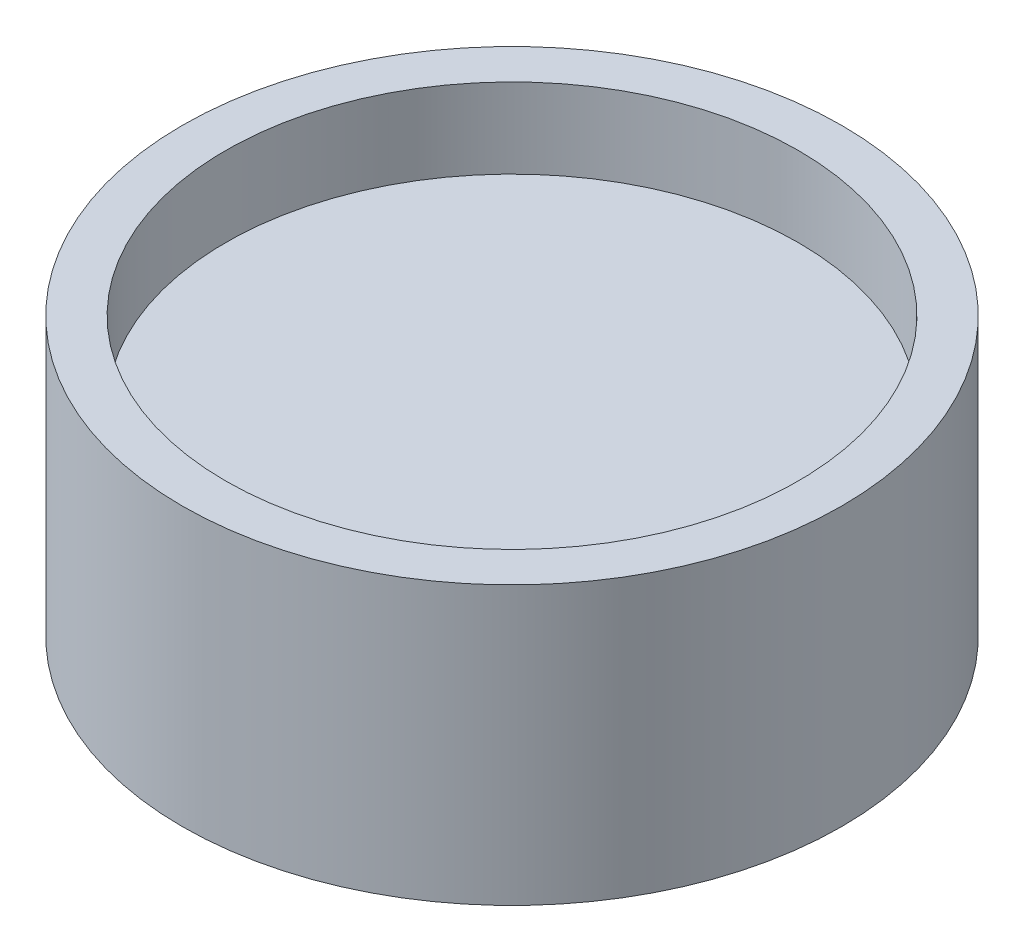
ISO-10303-21;
HEADER;
FILE_DESCRIPTION(('STEP AP214'),'2;1');
FILE_NAME('part.step','',(''),(''),'','','');
FILE_SCHEMA(('AUTOMOTIVE_DESIGN { 1 0 10303 214 1 1 1 1 }'));
ENDSEC;
DATA;
#1=APPLICATION_CONTEXT('core data for automotive mechanical design processes');
#2=APPLICATION_PROTOCOL_DEFINITION('international standard','automotive_design',2000,#1);
#3=PRODUCT_CONTEXT('',#1,'mechanical');
#4=PRODUCT('Part','Part','',(#3));
#5=PRODUCT_RELATED_PRODUCT_CATEGORY('part','',(#4));
#6=PRODUCT_DEFINITION_FORMATION('','',#4);
#7=PRODUCT_DEFINITION_CONTEXT('part definition',#1,'design');
#8=PRODUCT_DEFINITION('design','',#6,#7);
#9=PRODUCT_DEFINITION_SHAPE('','',#8);
#10=(LENGTH_UNIT() NAMED_UNIT(*) SI_UNIT(.MILLI.,.METRE.));
#11=(NAMED_UNIT(*) PLANE_ANGLE_UNIT() SI_UNIT($,.RADIAN.));
#12=(NAMED_UNIT(*) SI_UNIT($,.STERADIAN.) SOLID_ANGLE_UNIT());
#13=UNCERTAINTY_MEASURE_WITH_UNIT(LENGTH_MEASURE(1.E-05),#10,'distance_accuracy_value','');
#14=(GEOMETRIC_REPRESENTATION_CONTEXT(3) GLOBAL_UNCERTAINTY_ASSIGNED_CONTEXT((#13)) GLOBAL_UNIT_ASSIGNED_CONTEXT((#10,
#11,#12)) REPRESENTATION_CONTEXT('',''));
#15=CARTESIAN_POINT('',(0.,0.,0.));
#16=DIRECTION('',(0.,0.,1.));
#17=DIRECTION('',(1.,0.,0.));
#18=AXIS2_PLACEMENT_3D('',#15,#16,#17);
#19=CARTESIAN_POINT('',(0.,16.,0.));
#20=DIRECTION('',(0.,-1.,0.));
#21=DIRECTION('',(0.,0.,-1.));
#22=AXIS2_PLACEMENT_3D('',#19,#20,#21);
#23=CYLINDRICAL_SURFACE('',#22,19.);
#24=CARTESIAN_POINT('',(0.,16.,0.));
#25=DIRECTION('',(0.,1.,0.));
#26=DIRECTION('',(0.,0.,1.));
#27=AXIS2_PLACEMENT_3D('',#24,#25,#26);
#28=CIRCLE('',#27,19.);
#29=CARTESIAN_POINT('',(0.,16.,19.));
#30=VERTEX_POINT('',#29);
#31=EDGE_CURVE('E10',#30,#30,#28,.T.);
#32=ORIENTED_EDGE('',*,*,#31,.F.);
#33=EDGE_LOOP('',(#32));
#34=FACE_BOUND('',#33,.T.);
#35=CARTESIAN_POINT('',(0.,0.,0.));
#36=DIRECTION('',(0.,1.,0.));
#37=DIRECTION('',(0.,0.,1.));
#38=AXIS2_PLACEMENT_3D('',#35,#36,#37);
#39=CIRCLE('',#38,19.);
#40=CARTESIAN_POINT('',(0.,0.,19.));
#41=VERTEX_POINT('',#40);
#42=EDGE_CURVE('E40',#41,#41,#39,.T.);
#43=ORIENTED_EDGE('',*,*,#42,.T.);
#44=EDGE_LOOP('',(#43));
#45=FACE_BOUND('',#44,.T.);
#46=ADVANCED_FACE('F37',(#34,#45),#23,.T.);
#47=CARTESIAN_POINT('',(0.,16.,0.));
#48=DIRECTION('',(0.,1.,0.));
#49=DIRECTION('',(0.,0.,1.));
#50=AXIS2_PLACEMENT_3D('',#47,#48,#49);
#51=PLANE('',#50);
#52=CARTESIAN_POINT('',(0.,16.,0.));
#53=DIRECTION('',(0.,1.,0.));
#54=DIRECTION('',(0.,0.,1.));
#55=AXIS2_PLACEMENT_3D('',#52,#53,#54);
#56=CIRCLE('',#55,16.5);
#57=CARTESIAN_POINT('',(0.,16.,16.5));
#58=VERTEX_POINT('',#57);
#59=EDGE_CURVE('E49',#58,#58,#56,.T.);
#60=ORIENTED_EDGE('',*,*,#59,.F.);
#61=EDGE_LOOP('',(#60));
#62=FACE_BOUND('',#61,.T.);
#63=ORIENTED_EDGE('',*,*,#31,.T.);
#64=EDGE_LOOP('',(#63));
#65=FACE_BOUND('',#64,.T.);
#66=ADVANCED_FACE('F74',(#62,#65),#51,.T.);
#67=CARTESIAN_POINT('',(0.,0.,0.));
#68=DIRECTION('',(0.,1.,0.));
#69=DIRECTION('',(0.,0.,1.));
#70=AXIS2_PLACEMENT_3D('',#67,#68,#69);
#71=PLANE('',#70);
#72=CARTESIAN_POINT('',(0.,0.,0.));
#73=DIRECTION('',(0.,-1.,0.));
#74=DIRECTION('',(0.,0.,-1.));
#75=AXIS2_PLACEMENT_3D('',#72,#73,#74);
#76=CIRCLE('',#75,16.4);
#77=CARTESIAN_POINT('',(0.,0.,-16.4));
#78=VERTEX_POINT('',#77);
#79=EDGE_CURVE('E55',#78,#78,#76,.T.);
#80=ORIENTED_EDGE('',*,*,#79,.F.);
#81=EDGE_LOOP('',(#80));
#82=FACE_BOUND('',#81,.T.);
#83=ORIENTED_EDGE('',*,*,#42,.F.);
#84=EDGE_LOOP('',(#83));
#85=FACE_BOUND('',#84,.T.);
#86=ADVANCED_FACE('F70',(#82,#85),#71,.F.);
#87=CARTESIAN_POINT('',(0.,11.4,0.));
#88=DIRECTION('',(0.,1.,0.));
#89=DIRECTION('',(0.,0.,1.));
#90=AXIS2_PLACEMENT_3D('',#87,#88,#89);
#91=CYLINDRICAL_SURFACE('',#90,16.5);
#92=CARTESIAN_POINT('',(0.,11.4,0.));
#93=DIRECTION('',(0.,1.,0.));
#94=DIRECTION('',(0.,0.,1.));
#95=AXIS2_PLACEMENT_3D('',#92,#93,#94);
#96=CIRCLE('',#95,16.5);
#97=CARTESIAN_POINT('',(0.,11.4,16.5));
#98=VERTEX_POINT('',#97);
#99=EDGE_CURVE('E47',#98,#98,#96,.T.);
#100=ORIENTED_EDGE('',*,*,#99,.F.);
#101=EDGE_LOOP('',(#100));
#102=FACE_BOUND('',#101,.T.);
#103=ORIENTED_EDGE('',*,*,#59,.T.);
#104=EDGE_LOOP('',(#103));
#105=FACE_BOUND('',#104,.T.);
#106=ADVANCED_FACE('F73',(#102,#105),#91,.F.);
#107=CARTESIAN_POINT('',(0.,11.4,0.));
#108=DIRECTION('',(0.,1.,0.));
#109=DIRECTION('',(0.,0.,1.));
#110=AXIS2_PLACEMENT_3D('',#107,#108,#109);
#111=PLANE('',#110);
#112=ORIENTED_EDGE('',*,*,#99,.T.);
#113=EDGE_LOOP('',(#112));
#114=FACE_BOUND('',#113,.T.);
#115=ADVANCED_FACE('F66',(#114),#111,.T.);
#116=CARTESIAN_POINT('',(0.,4.6,0.));
#117=DIRECTION('',(0.,-1.,0.));
#118=DIRECTION('',(0.,0.,-1.));
#119=AXIS2_PLACEMENT_3D('',#116,#117,#118);
#120=CYLINDRICAL_SURFACE('',#119,16.4);
#121=CARTESIAN_POINT('',(0.,4.6,0.));
#122=DIRECTION('',(0.,-1.,0.));
#123=DIRECTION('',(0.,0.,-1.));
#124=AXIS2_PLACEMENT_3D('',#121,#122,#123);
#125=CIRCLE('',#124,16.4);
#126=CARTESIAN_POINT('',(0.,4.6,-16.4));
#127=VERTEX_POINT('',#126);
#128=EDGE_CURVE('E52',#127,#127,#125,.T.);
#129=ORIENTED_EDGE('',*,*,#128,.F.);
#130=EDGE_LOOP('',(#129));
#131=FACE_BOUND('',#130,.T.);
#132=ORIENTED_EDGE('',*,*,#79,.T.);
#133=EDGE_LOOP('',(#132));
#134=FACE_BOUND('',#133,.T.);
#135=ADVANCED_FACE('F63',(#131,#134),#120,.F.);
#136=CARTESIAN_POINT('',(0.,4.6,0.));
#137=DIRECTION('',(0.,-1.,0.));
#138=DIRECTION('',(0.,0.,-1.));
#139=AXIS2_PLACEMENT_3D('',#136,#137,#138);
#140=PLANE('',#139);
#141=ORIENTED_EDGE('',*,*,#128,.T.);
#142=EDGE_LOOP('',(#141));
#143=FACE_BOUND('',#142,.T.);
#144=ADVANCED_FACE('F61',(#143),#140,.T.);
#145=CLOSED_SHELL('',(#46,#66,#86,#106,#115,#135,#144));
#146=MANIFOLD_SOLID_BREP('B2',#145);
#147=ADVANCED_BREP_SHAPE_REPRESENTATION('',(#18,#146),#14);
#148=SHAPE_DEFINITION_REPRESENTATION(#9,#147);
ENDSEC;
END-ISO-10303-21;
